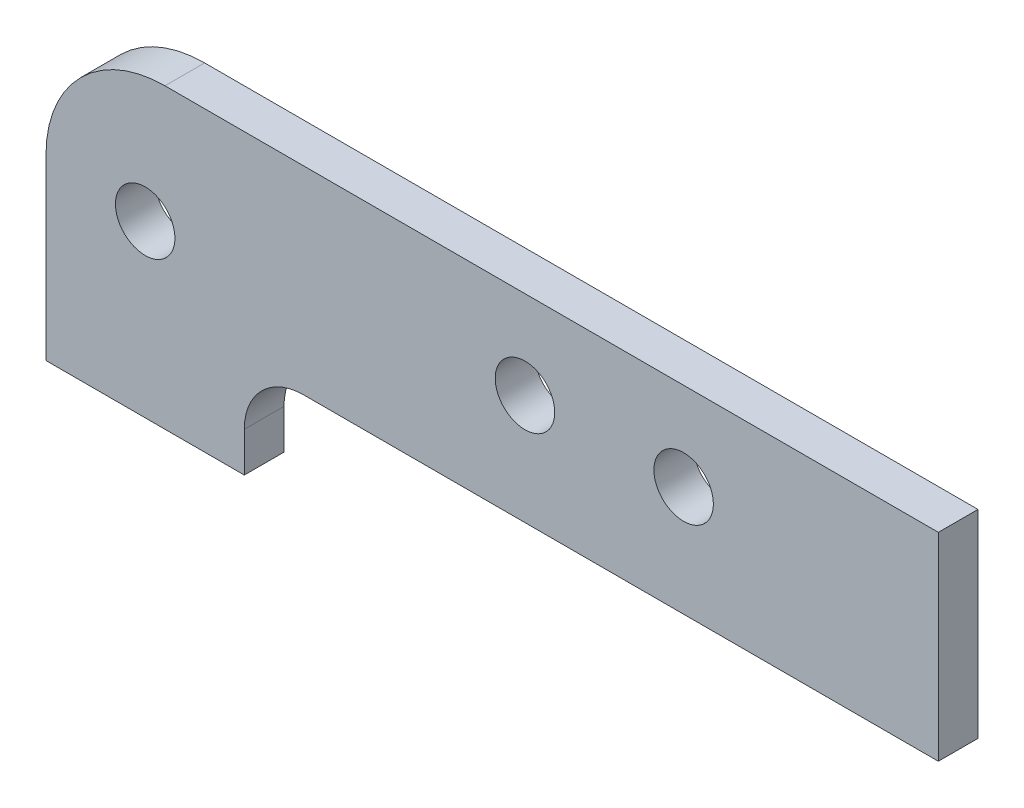
ISO-10303-21;
HEADER;
FILE_DESCRIPTION(('STEP AP214'),'2;1');
FILE_NAME('part.step','',(''),(''),'','','');
FILE_SCHEMA(('AUTOMOTIVE_DESIGN { 1 0 10303 214 1 1 1 1 }'));
ENDSEC;
DATA;
#1=APPLICATION_CONTEXT('core data for automotive mechanical design processes');
#2=APPLICATION_PROTOCOL_DEFINITION('international standard','automotive_design',2000,#1);
#3=PRODUCT_CONTEXT('',#1,'mechanical');
#4=PRODUCT('Part','Part','',(#3));
#5=PRODUCT_RELATED_PRODUCT_CATEGORY('part','',(#4));
#6=PRODUCT_DEFINITION_FORMATION('','',#4);
#7=PRODUCT_DEFINITION_CONTEXT('part definition',#1,'design');
#8=PRODUCT_DEFINITION('design','',#6,#7);
#9=PRODUCT_DEFINITION_SHAPE('','',#8);
#10=(LENGTH_UNIT() NAMED_UNIT(*) SI_UNIT(.MILLI.,.METRE.));
#11=(NAMED_UNIT(*) PLANE_ANGLE_UNIT() SI_UNIT($,.RADIAN.));
#12=(NAMED_UNIT(*) SI_UNIT($,.STERADIAN.) SOLID_ANGLE_UNIT());
#13=UNCERTAINTY_MEASURE_WITH_UNIT(LENGTH_MEASURE(1.E-05),#10,'distance_accuracy_value','');
#14=(GEOMETRIC_REPRESENTATION_CONTEXT(3) GLOBAL_UNCERTAINTY_ASSIGNED_CONTEXT((#13)) GLOBAL_UNIT_ASSIGNED_CONTEXT((#10,
#11,#12)) REPRESENTATION_CONTEXT('',''));
#15=CARTESIAN_POINT('',(0.,0.,0.));
#16=DIRECTION('',(0.,0.,1.));
#17=DIRECTION('',(1.,0.,0.));
#18=AXIS2_PLACEMENT_3D('',#15,#16,#17);
#19=CARTESIAN_POINT('',(17.5,5.,2.));
#20=DIRECTION('',(-1.,0.,0.));
#21=DIRECTION('',(0.,0.,1.));
#22=AXIS2_PLACEMENT_3D('',#19,#20,#21);
#23=PLANE('',#22);
#24=DIRECTION('',(0.,1.,0.));
#25=VECTOR('',#24,1.);
#26=CARTESIAN_POINT('',(17.5,5.,0.));
#27=LINE('',#26,#25);
#28=CARTESIAN_POINT('',(17.5,-5.,0.));
#29=VERTEX_POINT('',#28);
#30=CARTESIAN_POINT('',(17.5,5.,0.));
#31=VERTEX_POINT('',#30);
#32=EDGE_CURVE('E131',#29,#31,#27,.T.);
#33=ORIENTED_EDGE('',*,*,#32,.T.);
#34=DIRECTION('',(0.,0.,-1.));
#35=VECTOR('',#34,1.);
#36=CARTESIAN_POINT('',(17.5,5.,2.));
#37=LINE('',#36,#35);
#38=CARTESIAN_POINT('',(17.5,5.,2.));
#39=VERTEX_POINT('',#38);
#40=EDGE_CURVE('E11',#39,#31,#37,.T.);
#41=ORIENTED_EDGE('',*,*,#40,.F.);
#42=DIRECTION('',(0.,1.,0.));
#43=VECTOR('',#42,1.);
#44=CARTESIAN_POINT('',(17.5,5.,2.));
#45=LINE('',#44,#43);
#46=CARTESIAN_POINT('',(17.5,-5.,2.));
#47=VERTEX_POINT('',#46);
#48=EDGE_CURVE('E146',#47,#39,#45,.T.);
#49=ORIENTED_EDGE('',*,*,#48,.F.);
#50=DIRECTION('',(0.,0.,-1.));
#51=VECTOR('',#50,1.);
#52=CARTESIAN_POINT('',(17.5,-5.,2.));
#53=LINE('',#52,#51);
#54=EDGE_CURVE('E127',#47,#29,#53,.T.);
#55=ORIENTED_EDGE('',*,*,#54,.T.);
#56=EDGE_LOOP('',(#33,#41,#49,#55));
#57=FACE_BOUND('',#56,.T.);
#58=ADVANCED_FACE('F35',(#57),#23,.F.);
#59=CARTESIAN_POINT('',(-17.5,5.,2.));
#60=DIRECTION('',(0.,-1.,0.));
#61=DIRECTION('',(0.,0.,-1.));
#62=AXIS2_PLACEMENT_3D('',#59,#60,#61);
#63=PLANE('',#62);
#64=DIRECTION('',(-1.,0.,0.));
#65=VECTOR('',#64,1.);
#66=CARTESIAN_POINT('',(-17.5,5.,0.));
#67=LINE('',#66,#65);
#68=CARTESIAN_POINT('',(-21.5,5.,0.));
#69=VERTEX_POINT('',#68);
#70=EDGE_CURVE('E134',#31,#69,#67,.T.);
#71=ORIENTED_EDGE('',*,*,#70,.T.);
#72=DIRECTION('',(0.,0.,-1.));
#73=VECTOR('',#72,1.);
#74=CARTESIAN_POINT('',(-21.5,5.,2.));
#75=LINE('',#74,#73);
#76=CARTESIAN_POINT('',(-21.5,5.,2.));
#77=VERTEX_POINT('',#76);
#78=EDGE_CURVE('E43',#77,#69,#75,.T.);
#79=ORIENTED_EDGE('',*,*,#78,.F.);
#80=DIRECTION('',(-1.,0.,0.));
#81=VECTOR('',#80,1.);
#82=CARTESIAN_POINT('',(17.5,5.,2.));
#83=LINE('',#82,#81);
#84=EDGE_CURVE('E94',#39,#77,#83,.T.);
#85=ORIENTED_EDGE('',*,*,#84,.F.);
#86=ORIENTED_EDGE('',*,*,#40,.T.);
#87=EDGE_LOOP('',(#71,#79,#85,#86));
#88=FACE_BOUND('',#87,.T.);
#89=ADVANCED_FACE('F223',(#88),#63,.F.);
#90=CARTESIAN_POINT('',(-21.5,-1.,2.));
#91=DIRECTION('',(0.,0.,-1.));
#92=DIRECTION('',(-1.,0.,0.));
#93=AXIS2_PLACEMENT_3D('',#90,#91,#92);
#94=CYLINDRICAL_SURFACE('',#93,6.);
#95=CARTESIAN_POINT('',(-21.5,-1.,0.));
#96=DIRECTION('',(0.,0.,1.));
#97=DIRECTION('',(1.,0.,0.));
#98=AXIS2_PLACEMENT_3D('',#95,#96,#97);
#99=CIRCLE('',#98,6.);
#100=CARTESIAN_POINT('',(-27.5,-1.00000000000004,0.));
#101=VERTEX_POINT('',#100);
#102=EDGE_CURVE('E137',#69,#101,#99,.T.);
#103=ORIENTED_EDGE('',*,*,#102,.T.);
#104=DIRECTION('',(0.,0.,-1.));
#105=VECTOR('',#104,1.);
#106=CARTESIAN_POINT('',(-27.5,-1.00000000000004,2.));
#107=LINE('',#106,#105);
#108=CARTESIAN_POINT('',(-27.5,-1.00000000000004,2.));
#109=VERTEX_POINT('',#108);
#110=EDGE_CURVE('E153',#109,#101,#107,.T.);
#111=ORIENTED_EDGE('',*,*,#110,.F.);
#112=CARTESIAN_POINT('',(-21.5,-1.,2.));
#113=DIRECTION('',(0.,0.,1.));
#114=DIRECTION('',(1.,0.,0.));
#115=AXIS2_PLACEMENT_3D('',#112,#113,#114);
#116=CIRCLE('',#115,6.);
#117=EDGE_CURVE('E161',#77,#109,#116,.T.);
#118=ORIENTED_EDGE('',*,*,#117,.F.);
#119=ORIENTED_EDGE('',*,*,#78,.T.);
#120=EDGE_LOOP('',(#103,#111,#118,#119));
#121=FACE_BOUND('',#120,.T.);
#122=ADVANCED_FACE('F159',(#121),#94,.T.);
#123=CARTESIAN_POINT('',(-27.5,-1.00000000000004,2.));
#124=DIRECTION('',(1.,0.,0.));
#125=DIRECTION('',(0.,1.,0.));
#126=AXIS2_PLACEMENT_3D('',#123,#124,#125);
#127=PLANE('',#126);
#128=DIRECTION('',(0.,-1.,0.));
#129=VECTOR('',#128,1.);
#130=CARTESIAN_POINT('',(-27.5,-1.00000000000004,0.));
#131=LINE('',#130,#129);
#132=CARTESIAN_POINT('',(-27.5,-10.,0.));
#133=VERTEX_POINT('',#132);
#134=EDGE_CURVE('E139',#101,#133,#131,.T.);
#135=ORIENTED_EDGE('',*,*,#134,.T.);
#136=DIRECTION('',(0.,0.,-1.));
#137=VECTOR('',#136,1.);
#138=CARTESIAN_POINT('',(-27.5,-10.,2.));
#139=LINE('',#138,#137);
#140=CARTESIAN_POINT('',(-27.5,-10.,2.));
#141=VERTEX_POINT('',#140);
#142=EDGE_CURVE('E150',#141,#133,#139,.T.);
#143=ORIENTED_EDGE('',*,*,#142,.F.);
#144=DIRECTION('',(0.,-1.,0.));
#145=VECTOR('',#144,1.);
#146=CARTESIAN_POINT('',(-27.5,-1.00000000000004,2.));
#147=LINE('',#146,#145);
#148=EDGE_CURVE('E173',#109,#141,#147,.T.);
#149=ORIENTED_EDGE('',*,*,#148,.F.);
#150=ORIENTED_EDGE('',*,*,#110,.T.);
#151=EDGE_LOOP('',(#135,#143,#149,#150));
#152=FACE_BOUND('',#151,.T.);
#153=ADVANCED_FACE('F169',(#152),#127,.F.);
#154=CARTESIAN_POINT('',(-17.5,-10.,2.));
#155=DIRECTION('',(0.,1.,0.));
#156=DIRECTION('',(0.,0.,1.));
#157=AXIS2_PLACEMENT_3D('',#154,#155,#156);
#158=PLANE('',#157);
#159=DIRECTION('',(1.,0.,0.));
#160=VECTOR('',#159,1.);
#161=CARTESIAN_POINT('',(-17.5,-10.,0.));
#162=LINE('',#161,#160);
#163=CARTESIAN_POINT('',(-17.5,-10.,0.));
#164=VERTEX_POINT('',#163);
#165=EDGE_CURVE('E141',#133,#164,#162,.T.);
#166=ORIENTED_EDGE('',*,*,#165,.T.);
#167=DIRECTION('',(0.,0.,-1.));
#168=VECTOR('',#167,1.);
#169=CARTESIAN_POINT('',(-17.5,-10.,2.));
#170=LINE('',#169,#168);
#171=CARTESIAN_POINT('',(-17.5,-10.,2.));
#172=VERTEX_POINT('',#171);
#173=EDGE_CURVE('E122',#172,#164,#170,.T.);
#174=ORIENTED_EDGE('',*,*,#173,.F.);
#175=DIRECTION('',(1.,0.,0.));
#176=VECTOR('',#175,1.);
#177=CARTESIAN_POINT('',(-17.5,-10.,2.));
#178=LINE('',#177,#176);
#179=EDGE_CURVE('E113',#141,#172,#178,.T.);
#180=ORIENTED_EDGE('',*,*,#179,.F.);
#181=ORIENTED_EDGE('',*,*,#142,.T.);
#182=EDGE_LOOP('',(#166,#174,#180,#181));
#183=FACE_BOUND('',#182,.T.);
#184=ADVANCED_FACE('F172',(#183),#158,.F.);
#185=CARTESIAN_POINT('',(-17.5,-8.00000000000002,2.));
#186=DIRECTION('',(-1.,0.,0.));
#187=DIRECTION('',(0.,0.,1.));
#188=AXIS2_PLACEMENT_3D('',#185,#186,#187);
#189=PLANE('',#188);
#190=DIRECTION('',(0.,1.,0.));
#191=VECTOR('',#190,1.);
#192=CARTESIAN_POINT('',(-17.5,-8.00000000000002,0.));
#193=LINE('',#192,#191);
#194=CARTESIAN_POINT('',(-17.5,-8.00000000000002,0.));
#195=VERTEX_POINT('',#194);
#196=EDGE_CURVE('E121',#164,#195,#193,.T.);
#197=ORIENTED_EDGE('',*,*,#196,.T.);
#198=DIRECTION('',(0.,0.,-1.));
#199=VECTOR('',#198,1.);
#200=CARTESIAN_POINT('',(-17.5,-8.00000000000002,2.));
#201=LINE('',#200,#199);
#202=CARTESIAN_POINT('',(-17.5,-8.00000000000002,2.));
#203=VERTEX_POINT('',#202);
#204=EDGE_CURVE('E118',#203,#195,#201,.T.);
#205=ORIENTED_EDGE('',*,*,#204,.F.);
#206=DIRECTION('',(0.,1.,0.));
#207=VECTOR('',#206,1.);
#208=CARTESIAN_POINT('',(-17.5,-8.00000000000002,2.));
#209=LINE('',#208,#207);
#210=EDGE_CURVE('E107',#172,#203,#209,.T.);
#211=ORIENTED_EDGE('',*,*,#210,.F.);
#212=ORIENTED_EDGE('',*,*,#173,.T.);
#213=EDGE_LOOP('',(#197,#205,#211,#212));
#214=FACE_BOUND('',#213,.T.);
#215=ADVANCED_FACE('F119',(#214),#189,.F.);
#216=CARTESIAN_POINT('',(-14.5,-8.,2.));
#217=DIRECTION('',(0.,0.,-1.));
#218=DIRECTION('',(-1.,0.,0.));
#219=AXIS2_PLACEMENT_3D('',#216,#217,#218);
#220=CYLINDRICAL_SURFACE('',#219,3.);
#221=CARTESIAN_POINT('',(-14.5,-8.,0.));
#222=DIRECTION('',(0.,0.,-1.));
#223=DIRECTION('',(1.,0.,0.));
#224=AXIS2_PLACEMENT_3D('',#221,#222,#223);
#225=CIRCLE('',#224,3.);
#226=CARTESIAN_POINT('',(-14.5,-5.,0.));
#227=VERTEX_POINT('',#226);
#228=EDGE_CURVE('E80',#195,#227,#225,.T.);
#229=ORIENTED_EDGE('',*,*,#228,.T.);
#230=DIRECTION('',(0.,0.,-1.));
#231=VECTOR('',#230,1.);
#232=CARTESIAN_POINT('',(-14.5,-5.,2.));
#233=LINE('',#232,#231);
#234=CARTESIAN_POINT('',(-14.5,-5.,2.));
#235=VERTEX_POINT('',#234);
#236=EDGE_CURVE('E123',#235,#227,#233,.T.);
#237=ORIENTED_EDGE('',*,*,#236,.F.);
#238=CARTESIAN_POINT('',(-14.5,-8.,2.));
#239=DIRECTION('',(0.,0.,-1.));
#240=DIRECTION('',(1.,0.,0.));
#241=AXIS2_PLACEMENT_3D('',#238,#239,#240);
#242=CIRCLE('',#241,3.);
#243=EDGE_CURVE('E111',#203,#235,#242,.T.);
#244=ORIENTED_EDGE('',*,*,#243,.F.);
#245=ORIENTED_EDGE('',*,*,#204,.T.);
#246=EDGE_LOOP('',(#229,#237,#244,#245));
#247=FACE_BOUND('',#246,.T.);
#248=ADVANCED_FACE('F125',(#247),#220,.F.);
#249=CARTESIAN_POINT('',(17.5,-5.,2.));
#250=DIRECTION('',(0.,1.,0.));
#251=DIRECTION('',(-1.,0.,0.));
#252=AXIS2_PLACEMENT_3D('',#249,#250,#251);
#253=PLANE('',#252);
#254=DIRECTION('',(1.,0.,0.));
#255=VECTOR('',#254,1.);
#256=CARTESIAN_POINT('',(17.5,-5.,0.));
#257=LINE('',#256,#255);
#258=EDGE_CURVE('E86',#227,#29,#257,.T.);
#259=ORIENTED_EDGE('',*,*,#258,.T.);
#260=ORIENTED_EDGE('',*,*,#54,.F.);
#261=DIRECTION('',(1.,0.,0.));
#262=VECTOR('',#261,1.);
#263=CARTESIAN_POINT('',(17.5,-5.,2.));
#264=LINE('',#263,#262);
#265=EDGE_CURVE('E51',#235,#47,#264,.T.);
#266=ORIENTED_EDGE('',*,*,#265,.F.);
#267=ORIENTED_EDGE('',*,*,#236,.T.);
#268=EDGE_LOOP('',(#259,#260,#266,#267));
#269=FACE_BOUND('',#268,.T.);
#270=ADVANCED_FACE('F201',(#269),#253,.F.);
#271=CARTESIAN_POINT('',(-14.5,-8.,2.));
#272=DIRECTION('',(0.,0.,1.));
#273=DIRECTION('',(1.,0.,0.));
#274=AXIS2_PLACEMENT_3D('',#271,#272,#273);
#275=PLANE('',#274);
#276=CARTESIAN_POINT('',(4.65500000000036,0.556399926202823,2.));
#277=DIRECTION('',(0.,0.,1.));
#278=DIRECTION('',(1.,0.,0.));
#279=AXIS2_PLACEMENT_3D('',#276,#277,#278);
#280=CIRCLE('',#279,1.50000000000001);
#281=CARTESIAN_POINT('',(6.15500000000038,0.556399926202823,2.));
#282=VERTEX_POINT('',#281);
#283=EDGE_CURVE('E193',#282,#282,#280,.T.);
#284=ORIENTED_EDGE('',*,*,#283,.F.);
#285=EDGE_LOOP('',(#284));
#286=FACE_BOUND('',#285,.T.);
#287=CARTESIAN_POINT('',(-3.34499999999964,0.556399926202823,2.));
#288=DIRECTION('',(0.,0.,1.));
#289=DIRECTION('',(1.,0.,0.));
#290=AXIS2_PLACEMENT_3D('',#287,#288,#289);
#291=CIRCLE('',#290,1.50000000000001);
#292=CARTESIAN_POINT('',(-1.84499999999962,0.556399926202823,2.));
#293=VERTEX_POINT('',#292);
#294=EDGE_CURVE('E187',#293,#293,#291,.T.);
#295=ORIENTED_EDGE('',*,*,#294,.F.);
#296=EDGE_LOOP('',(#295));
#297=FACE_BOUND('',#296,.T.);
#298=CARTESIAN_POINT('',(-22.4983614167233,-1.41042207781744,2.));
#299=DIRECTION('',(0.,0.,1.));
#300=DIRECTION('',(1.,0.,0.));
#301=AXIS2_PLACEMENT_3D('',#298,#299,#300);
#302=CIRCLE('',#301,1.50000000000002);
#303=CARTESIAN_POINT('',(-20.9983614167233,-1.41042207781744,2.));
#304=VERTEX_POINT('',#303);
#305=EDGE_CURVE('E181',#304,#304,#302,.T.);
#306=ORIENTED_EDGE('',*,*,#305,.F.);
#307=EDGE_LOOP('',(#306));
#308=FACE_BOUND('',#307,.T.);
#309=ORIENTED_EDGE('',*,*,#48,.T.);
#310=ORIENTED_EDGE('',*,*,#84,.T.);
#311=ORIENTED_EDGE('',*,*,#117,.T.);
#312=ORIENTED_EDGE('',*,*,#148,.T.);
#313=ORIENTED_EDGE('',*,*,#179,.T.);
#314=ORIENTED_EDGE('',*,*,#210,.T.);
#315=ORIENTED_EDGE('',*,*,#243,.T.);
#316=ORIENTED_EDGE('',*,*,#265,.T.);
#317=EDGE_LOOP('',(#309,#310,#311,#312,#313,#314,#315,#316));
#318=FACE_BOUND('',#317,.T.);
#319=ADVANCED_FACE('F109',(#286,#297,#308,#318),#275,.T.);
#320=CARTESIAN_POINT('',(-14.5,-8.,0.));
#321=DIRECTION('',(0.,0.,1.));
#322=DIRECTION('',(1.,0.,0.));
#323=AXIS2_PLACEMENT_3D('',#320,#321,#322);
#324=PLANE('',#323);
#325=CARTESIAN_POINT('',(4.65500000000036,0.556399926202823,0.));
#326=DIRECTION('',(0.,0.,1.));
#327=DIRECTION('',(1.,0.,0.));
#328=AXIS2_PLACEMENT_3D('',#325,#326,#327);
#329=CIRCLE('',#328,1.50000000000001);
#330=CARTESIAN_POINT('',(6.15500000000038,0.556399926202823,0.));
#331=VERTEX_POINT('',#330);
#332=EDGE_CURVE('E190',#331,#331,#329,.T.);
#333=ORIENTED_EDGE('',*,*,#332,.T.);
#334=EDGE_LOOP('',(#333));
#335=FACE_BOUND('',#334,.T.);
#336=CARTESIAN_POINT('',(-3.34499999999964,0.556399926202823,0.));
#337=DIRECTION('',(0.,0.,1.));
#338=DIRECTION('',(1.,0.,0.));
#339=AXIS2_PLACEMENT_3D('',#336,#337,#338);
#340=CIRCLE('',#339,1.50000000000001);
#341=CARTESIAN_POINT('',(-1.84499999999962,0.556399926202823,0.));
#342=VERTEX_POINT('',#341);
#343=EDGE_CURVE('E184',#342,#342,#340,.T.);
#344=ORIENTED_EDGE('',*,*,#343,.T.);
#345=EDGE_LOOP('',(#344));
#346=FACE_BOUND('',#345,.T.);
#347=CARTESIAN_POINT('',(-22.4983614167233,-1.41042207781744,0.));
#348=DIRECTION('',(0.,0.,1.));
#349=DIRECTION('',(1.,0.,0.));
#350=AXIS2_PLACEMENT_3D('',#347,#348,#349);
#351=CIRCLE('',#350,1.50000000000001);
#352=CARTESIAN_POINT('',(-20.9983614167233,-1.41042207781744,0.));
#353=VERTEX_POINT('',#352);
#354=EDGE_CURVE('E135',#353,#353,#351,.T.);
#355=ORIENTED_EDGE('',*,*,#354,.T.);
#356=EDGE_LOOP('',(#355));
#357=FACE_BOUND('',#356,.T.);
#358=ORIENTED_EDGE('',*,*,#32,.F.);
#359=ORIENTED_EDGE('',*,*,#258,.F.);
#360=ORIENTED_EDGE('',*,*,#228,.F.);
#361=ORIENTED_EDGE('',*,*,#196,.F.);
#362=ORIENTED_EDGE('',*,*,#165,.F.);
#363=ORIENTED_EDGE('',*,*,#134,.F.);
#364=ORIENTED_EDGE('',*,*,#102,.F.);
#365=ORIENTED_EDGE('',*,*,#70,.F.);
#366=EDGE_LOOP('',(#358,#359,#360,#361,#362,#363,#364,#365));
#367=FACE_BOUND('',#366,.T.);
#368=ADVANCED_FACE('F165',(#335,#346,#357,#367),#324,.F.);
#369=CARTESIAN_POINT('',(-22.4983614167233,-1.41042207781744,2.));
#370=DIRECTION('',(0.,0.,1.));
#371=DIRECTION('',(1.,0.,0.));
#372=AXIS2_PLACEMENT_3D('',#369,#370,#371);
#373=CYLINDRICAL_SURFACE('',#372,1.50000000000001);
#374=ORIENTED_EDGE('',*,*,#354,.F.);
#375=EDGE_LOOP('',(#374));
#376=FACE_BOUND('',#375,.T.);
#377=ORIENTED_EDGE('',*,*,#305,.T.);
#378=EDGE_LOOP('',(#377));
#379=FACE_BOUND('',#378,.T.);
#380=ADVANCED_FACE('F207',(#376,#379),#373,.F.);
#381=CARTESIAN_POINT('',(-3.34499999999964,0.556399926202823,2.));
#382=DIRECTION('',(0.,0.,1.));
#383=DIRECTION('',(1.,0.,0.));
#384=AXIS2_PLACEMENT_3D('',#381,#382,#383);
#385=CYLINDRICAL_SURFACE('',#384,1.50000000000001);
#386=ORIENTED_EDGE('',*,*,#343,.F.);
#387=EDGE_LOOP('',(#386));
#388=FACE_BOUND('',#387,.T.);
#389=ORIENTED_EDGE('',*,*,#294,.T.);
#390=EDGE_LOOP('',(#389));
#391=FACE_BOUND('',#390,.T.);
#392=ADVANCED_FACE('F209',(#388,#391),#385,.F.);
#393=CARTESIAN_POINT('',(4.65500000000036,0.556399926202823,2.));
#394=DIRECTION('',(0.,0.,1.));
#395=DIRECTION('',(1.,0.,0.));
#396=AXIS2_PLACEMENT_3D('',#393,#394,#395);
#397=CYLINDRICAL_SURFACE('',#396,1.50000000000001);
#398=ORIENTED_EDGE('',*,*,#332,.F.);
#399=EDGE_LOOP('',(#398));
#400=FACE_BOUND('',#399,.T.);
#401=ORIENTED_EDGE('',*,*,#283,.T.);
#402=EDGE_LOOP('',(#401));
#403=FACE_BOUND('',#402,.T.);
#404=ADVANCED_FACE('F197',(#400,#403),#397,.F.);
#405=CLOSED_SHELL('',(#58,#89,#122,#153,#184,#215,#248,#270,#319,#368,#380,#392,#404));
#406=MANIFOLD_SOLID_BREP('B2',#405);
#407=ADVANCED_BREP_SHAPE_REPRESENTATION('',(#18,#406),#14);
#408=SHAPE_DEFINITION_REPRESENTATION(#9,#407);
ENDSEC;
END-ISO-10303-21;
